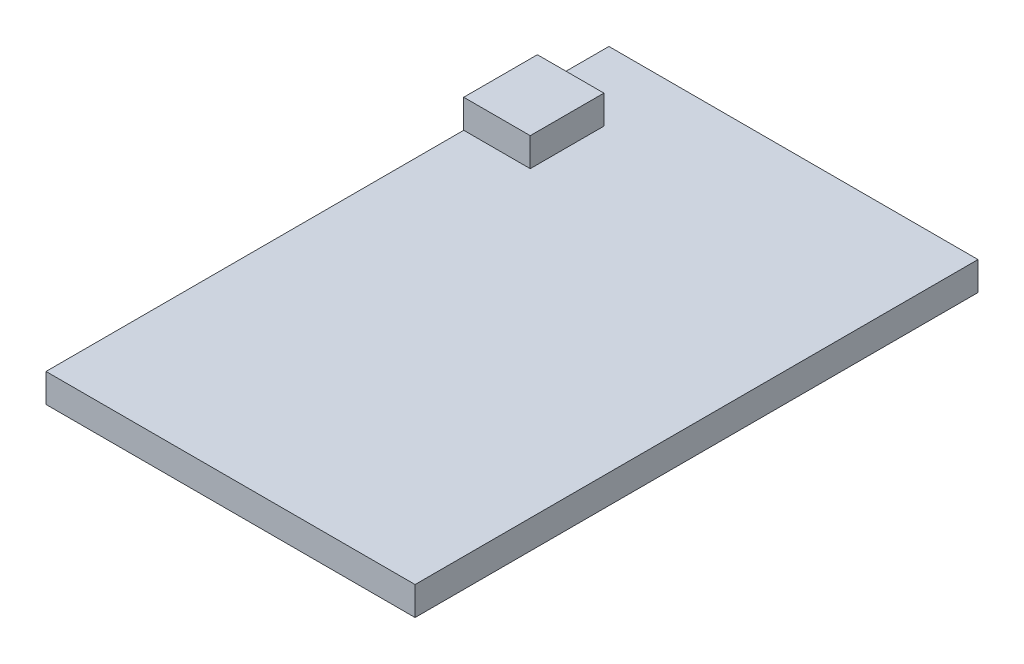
ISO-10303-21;
HEADER;
FILE_DESCRIPTION(('STEP AP214'),'2;1');
FILE_NAME('part.step','',(''),(''),'','','');
FILE_SCHEMA(('AUTOMOTIVE_DESIGN { 1 0 10303 214 1 1 1 1 }'));
ENDSEC;
DATA;
#1=APPLICATION_CONTEXT('core data for automotive mechanical design processes');
#2=APPLICATION_PROTOCOL_DEFINITION('international standard','automotive_design',2000,#1);
#3=PRODUCT_CONTEXT('',#1,'mechanical');
#4=PRODUCT('Part','Part','',(#3));
#5=PRODUCT_RELATED_PRODUCT_CATEGORY('part','',(#4));
#6=PRODUCT_DEFINITION_FORMATION('','',#4);
#7=PRODUCT_DEFINITION_CONTEXT('part definition',#1,'design');
#8=PRODUCT_DEFINITION('design','',#6,#7);
#9=PRODUCT_DEFINITION_SHAPE('','',#8);
#10=(LENGTH_UNIT() NAMED_UNIT(*) SI_UNIT(.MILLI.,.METRE.));
#11=(NAMED_UNIT(*) PLANE_ANGLE_UNIT() SI_UNIT($,.RADIAN.));
#12=(NAMED_UNIT(*) SI_UNIT($,.STERADIAN.) SOLID_ANGLE_UNIT());
#13=UNCERTAINTY_MEASURE_WITH_UNIT(LENGTH_MEASURE(1.E-05),#10,'distance_accuracy_value','');
#14=(GEOMETRIC_REPRESENTATION_CONTEXT(3) GLOBAL_UNCERTAINTY_ASSIGNED_CONTEXT((#13)) GLOBAL_UNIT_ASSIGNED_CONTEXT((#10,
#11,#12)) REPRESENTATION_CONTEXT('',''));
#15=CARTESIAN_POINT('',(0.,0.,0.));
#16=DIRECTION('',(0.,0.,1.));
#17=DIRECTION('',(1.,0.,0.));
#18=AXIS2_PLACEMENT_3D('',#15,#16,#17);
#19=CARTESIAN_POINT('',(25.8,4.,-39.35));
#20=DIRECTION('',(-1.,0.,0.));
#21=DIRECTION('',(0.,0.,1.));
#22=AXIS2_PLACEMENT_3D('',#19,#20,#21);
#23=PLANE('',#22);
#24=DIRECTION('',(0.,0.,-1.));
#25=VECTOR('',#24,1.);
#26=CARTESIAN_POINT('',(25.8,0.,-39.35));
#27=LINE('',#26,#25);
#28=CARTESIAN_POINT('',(25.8,0.,39.35));
#29=VERTEX_POINT('',#28);
#30=CARTESIAN_POINT('',(25.8,0.,-39.35));
#31=VERTEX_POINT('',#30);
#32=EDGE_CURVE('E125',#29,#31,#27,.T.);
#33=ORIENTED_EDGE('',*,*,#32,.T.);
#34=DIRECTION('',(0.,-1.,0.));
#35=VECTOR('',#34,1.);
#36=CARTESIAN_POINT('',(25.8,4.,-39.35));
#37=LINE('',#36,#35);
#38=CARTESIAN_POINT('',(25.8,4.,-39.35));
#39=VERTEX_POINT('',#38);
#40=EDGE_CURVE('E11',#39,#31,#37,.T.);
#41=ORIENTED_EDGE('',*,*,#40,.F.);
#42=DIRECTION('',(0.,0.,-1.));
#43=VECTOR('',#42,1.);
#44=CARTESIAN_POINT('',(25.8,4.,-39.35));
#45=LINE('',#44,#43);
#46=CARTESIAN_POINT('',(25.8,4.,39.35));
#47=VERTEX_POINT('',#46);
#48=EDGE_CURVE('E134',#47,#39,#45,.T.);
#49=ORIENTED_EDGE('',*,*,#48,.F.);
#50=DIRECTION('',(0.,-1.,0.));
#51=VECTOR('',#50,1.);
#52=CARTESIAN_POINT('',(25.8,4.,39.35));
#53=LINE('',#52,#51);
#54=EDGE_CURVE('E144',#47,#29,#53,.T.);
#55=ORIENTED_EDGE('',*,*,#54,.T.);
#56=EDGE_LOOP('',(#33,#41,#49,#55));
#57=FACE_BOUND('',#56,.T.);
#58=ADVANCED_FACE('F41',(#57),#23,.F.);
#59=CARTESIAN_POINT('',(-25.8,4.,-39.35));
#60=DIRECTION('',(0.,0.,1.));
#61=DIRECTION('',(1.,0.,0.));
#62=AXIS2_PLACEMENT_3D('',#59,#60,#61);
#63=PLANE('',#62);
#64=DIRECTION('',(-1.,0.,0.));
#65=VECTOR('',#64,1.);
#66=CARTESIAN_POINT('',(-25.8,0.,-39.35));
#67=LINE('',#66,#65);
#68=CARTESIAN_POINT('',(-25.8,0.,-39.35));
#69=VERTEX_POINT('',#68);
#70=EDGE_CURVE('E128',#31,#69,#67,.T.);
#71=ORIENTED_EDGE('',*,*,#70,.T.);
#72=DIRECTION('',(0.,-1.,0.));
#73=VECTOR('',#72,1.);
#74=CARTESIAN_POINT('',(-25.8,4.,-39.35));
#75=LINE('',#74,#73);
#76=CARTESIAN_POINT('',(-25.8,4.,-39.35));
#77=VERTEX_POINT('',#76);
#78=EDGE_CURVE('E48',#77,#69,#75,.T.);
#79=ORIENTED_EDGE('',*,*,#78,.F.);
#80=DIRECTION('',(-1.,0.,0.));
#81=VECTOR('',#80,1.);
#82=CARTESIAN_POINT('',(-25.8,4.,-39.35));
#83=LINE('',#82,#81);
#84=EDGE_CURVE('E137',#39,#77,#83,.T.);
#85=ORIENTED_EDGE('',*,*,#84,.F.);
#86=ORIENTED_EDGE('',*,*,#40,.T.);
#87=EDGE_LOOP('',(#71,#79,#85,#86));
#88=FACE_BOUND('',#87,.T.);
#89=ADVANCED_FACE('F195',(#88),#63,.F.);
#90=CARTESIAN_POINT('',(-25.8,4.,-39.35));
#91=DIRECTION('',(1.,0.,0.));
#92=DIRECTION('',(0.,0.,-1.));
#93=AXIS2_PLACEMENT_3D('',#90,#91,#92);
#94=PLANE('',#93);
#95=DIRECTION('',(0.,0.,1.));
#96=VECTOR('',#95,1.);
#97=CARTESIAN_POINT('',(-25.8,0.,-39.35));
#98=LINE('',#97,#96);
#99=CARTESIAN_POINT('',(-25.8,0.,39.35));
#100=VERTEX_POINT('',#99);
#101=EDGE_CURVE('E147',#69,#100,#98,.T.);
#102=ORIENTED_EDGE('',*,*,#101,.T.);
#103=DIRECTION('',(0.,-1.,0.));
#104=VECTOR('',#103,1.);
#105=CARTESIAN_POINT('',(-25.8,4.,39.35));
#106=LINE('',#105,#104);
#107=CARTESIAN_POINT('',(-25.8,4.,39.35));
#108=VERTEX_POINT('',#107);
#109=EDGE_CURVE('E152',#108,#100,#106,.T.);
#110=ORIENTED_EDGE('',*,*,#109,.F.);
#111=DIRECTION('',(0.,0.,1.));
#112=VECTOR('',#111,1.);
#113=CARTESIAN_POINT('',(-25.8,4.,-39.35));
#114=LINE('',#113,#112);
#115=CARTESIAN_POINT('',(-25.8,4.,-19.05));
#116=VERTEX_POINT('',#115);
#117=EDGE_CURVE('E140',#116,#108,#114,.T.);
#118=ORIENTED_EDGE('',*,*,#117,.F.);
#119=DIRECTION('',(0.,-1.,0.));
#120=VECTOR('',#119,1.);
#121=CARTESIAN_POINT('',(-25.8,8.,-19.05));
#122=LINE('',#121,#120);
#123=CARTESIAN_POINT('',(-25.8,8.,-19.05));
#124=VERTEX_POINT('',#123);
#125=EDGE_CURVE('E130',#124,#116,#122,.T.);
#126=ORIENTED_EDGE('',*,*,#125,.F.);
#127=DIRECTION('',(0.,0.,1.));
#128=VECTOR('',#127,1.);
#129=CARTESIAN_POINT('',(-25.8,8.,-29.35));
#130=LINE('',#129,#128);
#131=CARTESIAN_POINT('',(-25.8,8.,-29.35));
#132=VERTEX_POINT('',#131);
#133=EDGE_CURVE('E112',#132,#124,#130,.T.);
#134=ORIENTED_EDGE('',*,*,#133,.F.);
#135=DIRECTION('',(0.,-1.,0.));
#136=VECTOR('',#135,1.);
#137=CARTESIAN_POINT('',(-25.8,8.,-29.35));
#138=LINE('',#137,#136);
#139=CARTESIAN_POINT('',(-25.8,4.,-29.35));
#140=VERTEX_POINT('',#139);
#141=EDGE_CURVE('E109',#132,#140,#138,.T.);
#142=ORIENTED_EDGE('',*,*,#141,.T.);
#143=EDGE_CURVE('E141',#77,#140,#114,.T.);
#144=ORIENTED_EDGE('',*,*,#143,.F.);
#145=ORIENTED_EDGE('',*,*,#78,.T.);
#146=EDGE_LOOP('',(#102,#110,#118,#126,#134,#142,#144,#145));
#147=FACE_BOUND('',#146,.T.);
#148=ADVANCED_FACE('F159',(#147),#94,.F.);
#149=CARTESIAN_POINT('',(-25.8,4.,39.35));
#150=DIRECTION('',(0.,0.,-1.));
#151=DIRECTION('',(-1.,0.,0.));
#152=AXIS2_PLACEMENT_3D('',#149,#150,#151);
#153=PLANE('',#152);
#154=DIRECTION('',(1.,0.,0.));
#155=VECTOR('',#154,1.);
#156=CARTESIAN_POINT('',(-25.8,0.,39.35));
#157=LINE('',#156,#155);
#158=EDGE_CURVE('E138',#100,#29,#157,.T.);
#159=ORIENTED_EDGE('',*,*,#158,.T.);
#160=ORIENTED_EDGE('',*,*,#54,.F.);
#161=DIRECTION('',(1.,0.,0.));
#162=VECTOR('',#161,1.);
#163=CARTESIAN_POINT('',(-25.8,4.,39.35));
#164=LINE('',#163,#162);
#165=EDGE_CURVE('E143',#108,#47,#164,.T.);
#166=ORIENTED_EDGE('',*,*,#165,.F.);
#167=ORIENTED_EDGE('',*,*,#109,.T.);
#168=EDGE_LOOP('',(#159,#160,#166,#167));
#169=FACE_BOUND('',#168,.T.);
#170=ADVANCED_FACE('F168',(#169),#153,.F.);
#171=CARTESIAN_POINT('',(0.,4.,0.));
#172=DIRECTION('',(0.,1.,0.));
#173=DIRECTION('',(0.,0.,1.));
#174=AXIS2_PLACEMENT_3D('',#171,#172,#173);
#175=PLANE('',#174);
#176=DIRECTION('',(1.,0.,0.));
#177=VECTOR('',#176,1.);
#178=CARTESIAN_POINT('',(-25.8,4.,-19.05));
#179=LINE('',#178,#177);
#180=CARTESIAN_POINT('',(-16.5,4.,-19.05));
#181=VERTEX_POINT('',#180);
#182=EDGE_CURVE('E122',#116,#181,#179,.T.);
#183=ORIENTED_EDGE('',*,*,#182,.F.);
#184=ORIENTED_EDGE('',*,*,#117,.T.);
#185=ORIENTED_EDGE('',*,*,#165,.T.);
#186=ORIENTED_EDGE('',*,*,#48,.T.);
#187=ORIENTED_EDGE('',*,*,#84,.T.);
#188=ORIENTED_EDGE('',*,*,#143,.T.);
#189=DIRECTION('',(-1.,0.,0.));
#190=VECTOR('',#189,1.);
#191=CARTESIAN_POINT('',(-25.8,4.,-29.35));
#192=LINE('',#191,#190);
#193=CARTESIAN_POINT('',(-16.5,4.,-29.35));
#194=VERTEX_POINT('',#193);
#195=EDGE_CURVE('E60',#194,#140,#192,.T.);
#196=ORIENTED_EDGE('',*,*,#195,.F.);
#197=DIRECTION('',(0.,0.,-1.));
#198=VECTOR('',#197,1.);
#199=CARTESIAN_POINT('',(-16.5,4.,-29.35));
#200=LINE('',#199,#198);
#201=EDGE_CURVE('E55',#181,#194,#200,.T.);
#202=ORIENTED_EDGE('',*,*,#201,.F.);
#203=EDGE_LOOP('',(#183,#184,#185,#186,#187,#188,#196,#202));
#204=FACE_BOUND('',#203,.T.);
#205=ADVANCED_FACE('F173',(#204),#175,.T.);
#206=CARTESIAN_POINT('',(0.,0.,0.));
#207=DIRECTION('',(0.,1.,0.));
#208=DIRECTION('',(0.,0.,1.));
#209=AXIS2_PLACEMENT_3D('',#206,#207,#208);
#210=PLANE('',#209);
#211=ORIENTED_EDGE('',*,*,#32,.F.);
#212=ORIENTED_EDGE('',*,*,#158,.F.);
#213=ORIENTED_EDGE('',*,*,#101,.F.);
#214=ORIENTED_EDGE('',*,*,#70,.F.);
#215=EDGE_LOOP('',(#211,#212,#213,#214));
#216=FACE_BOUND('',#215,.T.);
#217=ADVANCED_FACE('F165',(#216),#210,.F.);
#218=CARTESIAN_POINT('',(-16.5,8.,-29.35));
#219=DIRECTION('',(-1.,0.,0.));
#220=DIRECTION('',(0.,0.,1.));
#221=AXIS2_PLACEMENT_3D('',#218,#219,#220);
#222=PLANE('',#221);
#223=ORIENTED_EDGE('',*,*,#201,.T.);
#224=DIRECTION('',(0.,-1.,0.));
#225=VECTOR('',#224,1.);
#226=CARTESIAN_POINT('',(-16.5,8.,-29.35));
#227=LINE('',#226,#225);
#228=CARTESIAN_POINT('',(-16.5,8.,-29.35));
#229=VERTEX_POINT('',#228);
#230=EDGE_CURVE('E107',#229,#194,#227,.T.);
#231=ORIENTED_EDGE('',*,*,#230,.F.);
#232=DIRECTION('',(0.,0.,-1.));
#233=VECTOR('',#232,1.);
#234=CARTESIAN_POINT('',(-16.5,8.,-29.35));
#235=LINE('',#234,#233);
#236=CARTESIAN_POINT('',(-16.5,8.,-19.05));
#237=VERTEX_POINT('',#236);
#238=EDGE_CURVE('E113',#237,#229,#235,.T.);
#239=ORIENTED_EDGE('',*,*,#238,.F.);
#240=DIRECTION('',(0.,-1.,0.));
#241=VECTOR('',#240,1.);
#242=CARTESIAN_POINT('',(-16.5,8.,-19.05));
#243=LINE('',#242,#241);
#244=EDGE_CURVE('E179',#237,#181,#243,.T.);
#245=ORIENTED_EDGE('',*,*,#244,.T.);
#246=EDGE_LOOP('',(#223,#231,#239,#245));
#247=FACE_BOUND('',#246,.T.);
#248=ADVANCED_FACE('F124',(#247),#222,.F.);
#249=CARTESIAN_POINT('',(-25.8,8.,-29.35));
#250=DIRECTION('',(0.,0.,1.));
#251=DIRECTION('',(1.,0.,0.));
#252=AXIS2_PLACEMENT_3D('',#249,#250,#251);
#253=PLANE('',#252);
#254=ORIENTED_EDGE('',*,*,#195,.T.);
#255=ORIENTED_EDGE('',*,*,#141,.F.);
#256=DIRECTION('',(-1.,0.,0.));
#257=VECTOR('',#256,1.);
#258=CARTESIAN_POINT('',(-25.8,8.,-29.35));
#259=LINE('',#258,#257);
#260=EDGE_CURVE('E103',#229,#132,#259,.T.);
#261=ORIENTED_EDGE('',*,*,#260,.F.);
#262=ORIENTED_EDGE('',*,*,#230,.T.);
#263=EDGE_LOOP('',(#254,#255,#261,#262));
#264=FACE_BOUND('',#263,.T.);
#265=ADVANCED_FACE('F105',(#264),#253,.F.);
#266=CARTESIAN_POINT('',(-25.8,8.,-19.05));
#267=DIRECTION('',(0.,0.,-1.));
#268=DIRECTION('',(-1.,0.,0.));
#269=AXIS2_PLACEMENT_3D('',#266,#267,#268);
#270=PLANE('',#269);
#271=ORIENTED_EDGE('',*,*,#182,.T.);
#272=ORIENTED_EDGE('',*,*,#244,.F.);
#273=DIRECTION('',(1.,0.,0.));
#274=VECTOR('',#273,1.);
#275=CARTESIAN_POINT('',(-25.8,8.,-19.05));
#276=LINE('',#275,#274);
#277=EDGE_CURVE('E118',#124,#237,#276,.T.);
#278=ORIENTED_EDGE('',*,*,#277,.F.);
#279=ORIENTED_EDGE('',*,*,#125,.T.);
#280=EDGE_LOOP('',(#271,#272,#278,#279));
#281=FACE_BOUND('',#280,.T.);
#282=ADVANCED_FACE('F178',(#281),#270,.F.);
#283=CARTESIAN_POINT('',(0.,8.,0.));
#284=DIRECTION('',(0.,1.,0.));
#285=DIRECTION('',(0.,0.,1.));
#286=AXIS2_PLACEMENT_3D('',#283,#284,#285);
#287=PLANE('',#286);
#288=ORIENTED_EDGE('',*,*,#238,.T.);
#289=ORIENTED_EDGE('',*,*,#260,.T.);
#290=ORIENTED_EDGE('',*,*,#133,.T.);
#291=ORIENTED_EDGE('',*,*,#277,.T.);
#292=EDGE_LOOP('',(#288,#289,#290,#291));
#293=FACE_BOUND('',#292,.T.);
#294=ADVANCED_FACE('F116',(#293),#287,.T.);
#295=CLOSED_SHELL('',(#58,#89,#148,#170,#205,#217,#248,#265,#282,#294));
#296=MANIFOLD_SOLID_BREP('B2',#295);
#297=ADVANCED_BREP_SHAPE_REPRESENTATION('',(#18,#296),#14);
#298=SHAPE_DEFINITION_REPRESENTATION(#9,#297);
ENDSEC;
END-ISO-10303-21;
